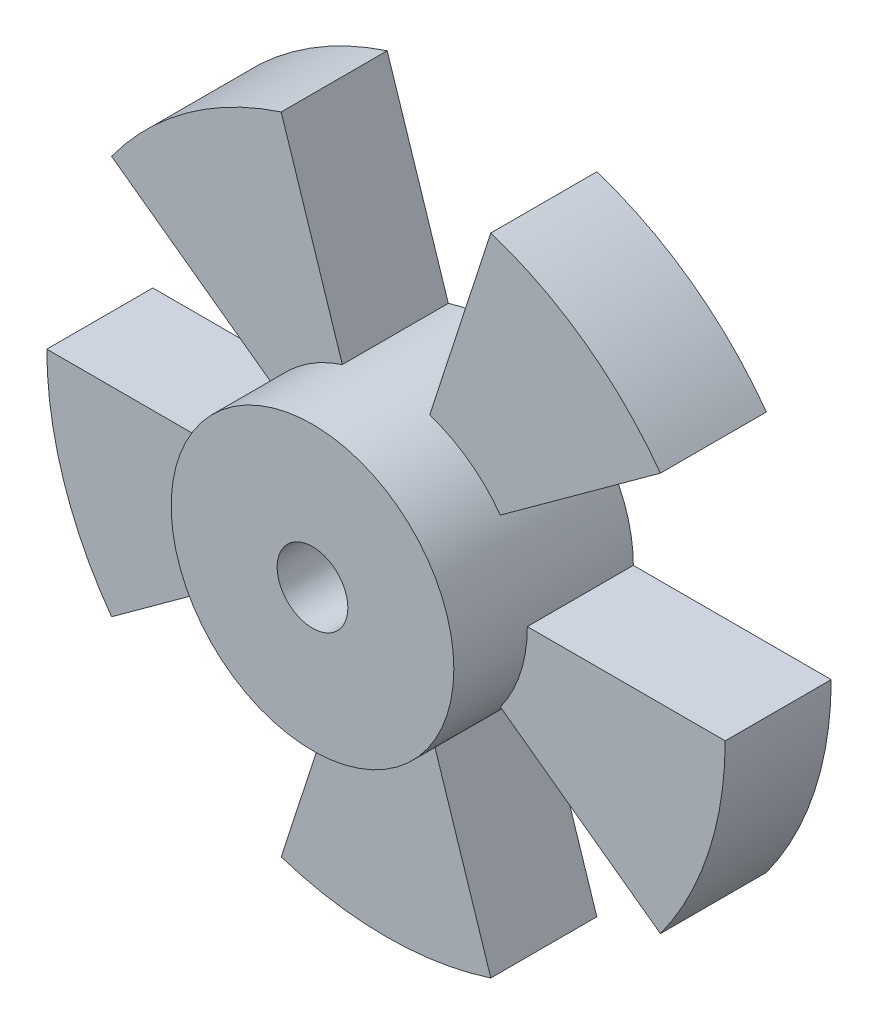
ISO-10303-21;
HEADER;
FILE_DESCRIPTION(('STEP AP214'),'2;1');
FILE_NAME('part.step','',(''),(''),'','','');
FILE_SCHEMA(('AUTOMOTIVE_DESIGN { 1 0 10303 214 1 1 1 1 }'));
ENDSEC;
DATA;
#1=APPLICATION_CONTEXT('core data for automotive mechanical design processes');
#2=APPLICATION_PROTOCOL_DEFINITION('international standard','automotive_design',2000,#1);
#3=PRODUCT_CONTEXT('',#1,'mechanical');
#4=PRODUCT('Part','Part','',(#3));
#5=PRODUCT_RELATED_PRODUCT_CATEGORY('part','',(#4));
#6=PRODUCT_DEFINITION_FORMATION('','',#4);
#7=PRODUCT_DEFINITION_CONTEXT('part definition',#1,'design');
#8=PRODUCT_DEFINITION('design','',#6,#7);
#9=PRODUCT_DEFINITION_SHAPE('','',#8);
#10=(LENGTH_UNIT() NAMED_UNIT(*) SI_UNIT(.MILLI.,.METRE.));
#11=(NAMED_UNIT(*) PLANE_ANGLE_UNIT() SI_UNIT($,.RADIAN.));
#12=(NAMED_UNIT(*) SI_UNIT($,.STERADIAN.) SOLID_ANGLE_UNIT());
#13=UNCERTAINTY_MEASURE_WITH_UNIT(LENGTH_MEASURE(1.E-05),#10,'distance_accuracy_value','');
#14=(GEOMETRIC_REPRESENTATION_CONTEXT(3) GLOBAL_UNCERTAINTY_ASSIGNED_CONTEXT((#13)) GLOBAL_UNIT_ASSIGNED_CONTEXT((#10,
#11,#12)) REPRESENTATION_CONTEXT('',''));
#15=CARTESIAN_POINT('',(0.,0.,0.));
#16=DIRECTION('',(0.,0.,1.));
#17=DIRECTION('',(1.,0.,0.));
#18=AXIS2_PLACEMENT_3D('',#15,#16,#17);
#19=CARTESIAN_POINT('',(0.,0.,3.));
#20=DIRECTION('',(0.,0.,-1.));
#21=DIRECTION('',(-1.,0.,0.));
#22=AXIS2_PLACEMENT_3D('',#19,#20,#21);
#23=CYLINDRICAL_SURFACE('',#22,2.);
#24=CARTESIAN_POINT('',(0.,0.,1.5));
#25=DIRECTION('',(0.,0.,1.));
#26=DIRECTION('',(1.,0.,0.));
#27=AXIS2_PLACEMENT_3D('',#24,#25,#26);
#28=CIRCLE('',#27,2.);
#29=CARTESIAN_POINT('',(-0.618033988749897,1.90211303259031,1.5));
#30=VERTEX_POINT('',#29);
#31=CARTESIAN_POINT('',(-1.6180339887499,1.17557050458494,1.5));
#32=VERTEX_POINT('',#31);
#33=EDGE_CURVE('E307',#30,#32,#28,.T.);
#34=ORIENTED_EDGE('',*,*,#33,.T.);
#35=DIRECTION('',(0.,0.,1.));
#36=VECTOR('',#35,1.);
#37=CARTESIAN_POINT('',(-1.6180339887499,1.17557050458494,-0.000999999999999916));
#38=LINE('',#37,#36);
#39=CARTESIAN_POINT('',(-1.6180339887499,1.17557050458494,0.));
#40=VERTEX_POINT('',#39);
#41=EDGE_CURVE('E267',#40,#32,#38,.T.);
#42=ORIENTED_EDGE('',*,*,#41,.F.);
#43=CARTESIAN_POINT('',(0.,0.,0.));
#44=DIRECTION('',(0.,0.,1.));
#45=DIRECTION('',(1.,0.,0.));
#46=AXIS2_PLACEMENT_3D('',#43,#44,#45);
#47=CIRCLE('',#46,2.);
#48=CARTESIAN_POINT('',(-2.,0.,0.));
#49=VERTEX_POINT('',#48);
#50=EDGE_CURVE('E256',#40,#49,#47,.T.);
#51=ORIENTED_EDGE('',*,*,#50,.T.);
#52=DIRECTION('',(0.,0.,1.));
#53=VECTOR('',#52,1.);
#54=CARTESIAN_POINT('',(-2.,0.,-0.000999999999999916));
#55=LINE('',#54,#53);
#56=CARTESIAN_POINT('',(-2.,0.,1.5));
#57=VERTEX_POINT('',#56);
#58=EDGE_CURVE('E268',#49,#57,#55,.T.);
#59=ORIENTED_EDGE('',*,*,#58,.T.);
#60=CARTESIAN_POINT('',(-1.61803398874989,-1.17557050458495,1.5));
#61=VERTEX_POINT('',#60);
#62=EDGE_CURVE('E309',#57,#61,#28,.T.);
#63=ORIENTED_EDGE('',*,*,#62,.T.);
#64=DIRECTION('',(0.,0.,1.));
#65=VECTOR('',#64,1.);
#66=CARTESIAN_POINT('',(-1.61803398874989,-1.17557050458495,-0.000999999999999916));
#67=LINE('',#66,#65);
#68=CARTESIAN_POINT('',(-1.61803398874989,-1.17557050458495,0.));
#69=VERTEX_POINT('',#68);
#70=EDGE_CURVE('E243',#69,#61,#67,.T.);
#71=ORIENTED_EDGE('',*,*,#70,.F.);
#72=CARTESIAN_POINT('',(0.,0.,0.));
#73=DIRECTION('',(0.,0.,1.));
#74=DIRECTION('',(1.,0.,0.));
#75=AXIS2_PLACEMENT_3D('',#72,#73,#74);
#76=CIRCLE('',#75,2.);
#77=CARTESIAN_POINT('',(-0.618033988749882,-1.90211303259031,0.));
#78=VERTEX_POINT('',#77);
#79=EDGE_CURVE('E232',#69,#78,#76,.T.);
#80=ORIENTED_EDGE('',*,*,#79,.T.);
#81=DIRECTION('',(0.,0.,1.));
#82=VECTOR('',#81,1.);
#83=CARTESIAN_POINT('',(-0.618033988749882,-1.90211303259031,-0.000999999999999916));
#84=LINE('',#83,#82);
#85=CARTESIAN_POINT('',(-0.618033988749882,-1.90211303259031,1.5));
#86=VERTEX_POINT('',#85);
#87=EDGE_CURVE('E244',#78,#86,#84,.T.);
#88=ORIENTED_EDGE('',*,*,#87,.T.);
#89=CARTESIAN_POINT('',(0.618033988749909,-1.9021130325903,1.5));
#90=VERTEX_POINT('',#89);
#91=EDGE_CURVE('E342',#86,#90,#28,.T.);
#92=ORIENTED_EDGE('',*,*,#91,.T.);
#93=DIRECTION('',(0.,0.,1.));
#94=VECTOR('',#93,1.);
#95=CARTESIAN_POINT('',(0.618033988749909,-1.9021130325903,-0.000999999999999916));
#96=LINE('',#95,#94);
#97=CARTESIAN_POINT('',(0.618033988749909,-1.9021130325903,0.));
#98=VERTEX_POINT('',#97);
#99=EDGE_CURVE('E220',#98,#90,#96,.T.);
#100=ORIENTED_EDGE('',*,*,#99,.F.);
#101=CARTESIAN_POINT('',(0.,0.,0.));
#102=DIRECTION('',(0.,0.,1.));
#103=DIRECTION('',(1.,0.,0.));
#104=AXIS2_PLACEMENT_3D('',#101,#102,#103);
#105=CIRCLE('',#104,2.);
#106=CARTESIAN_POINT('',(1.61803398874991,-1.17557050458493,0.));
#107=VERTEX_POINT('',#106);
#108=EDGE_CURVE('E192',#98,#107,#105,.T.);
#109=ORIENTED_EDGE('',*,*,#108,.T.);
#110=DIRECTION('',(0.,0.,1.));
#111=VECTOR('',#110,1.);
#112=CARTESIAN_POINT('',(1.61803398874991,-1.17557050458493,-0.000999999999999916));
#113=LINE('',#112,#111);
#114=CARTESIAN_POINT('',(1.61803398874991,-1.17557050458493,1.5));
#115=VERTEX_POINT('',#114);
#116=EDGE_CURVE('E221',#107,#115,#113,.T.);
#117=ORIENTED_EDGE('',*,*,#116,.T.);
#118=CARTESIAN_POINT('',(2.,0.,1.5));
#119=VERTEX_POINT('',#118);
#120=EDGE_CURVE('E180',#115,#119,#28,.T.);
#121=ORIENTED_EDGE('',*,*,#120,.T.);
#122=DIRECTION('',(0.,0.,1.));
#123=VECTOR('',#122,1.);
#124=CARTESIAN_POINT('',(2.,0.,-0.000999999999999916));
#125=LINE('',#124,#123);
#126=CARTESIAN_POINT('',(2.,0.,0.));
#127=VERTEX_POINT('',#126);
#128=EDGE_CURVE('E172',#127,#119,#125,.T.);
#129=ORIENTED_EDGE('',*,*,#128,.F.);
#130=CARTESIAN_POINT('',(0.,0.,0.));
#131=DIRECTION('',(0.,0.,1.));
#132=DIRECTION('',(1.,0.,0.));
#133=AXIS2_PLACEMENT_3D('',#130,#131,#132);
#134=CIRCLE('',#133,2.);
#135=CARTESIAN_POINT('',(1.61803398874988,1.17557050458497,0.));
#136=VERTEX_POINT('',#135);
#137=EDGE_CURVE('E177',#127,#136,#134,.T.);
#138=ORIENTED_EDGE('',*,*,#137,.T.);
#139=DIRECTION('',(0.,0.,1.));
#140=VECTOR('',#139,1.);
#141=CARTESIAN_POINT('',(1.61803398874988,1.17557050458497,-0.000999999999999916));
#142=LINE('',#141,#140);
#143=CARTESIAN_POINT('',(1.61803398874988,1.17557050458497,1.5));
#144=VERTEX_POINT('',#143);
#145=EDGE_CURVE('E193',#136,#144,#142,.T.);
#146=ORIENTED_EDGE('',*,*,#145,.T.);
#147=CARTESIAN_POINT('',(0.618033988749897,1.90211303259031,1.5));
#148=VERTEX_POINT('',#147);
#149=EDGE_CURVE('E306',#144,#148,#28,.T.);
#150=ORIENTED_EDGE('',*,*,#149,.T.);
#151=DIRECTION('',(0.,0.,1.));
#152=VECTOR('',#151,1.);
#153=CARTESIAN_POINT('',(0.618033988749897,1.90211303259031,-0.000999999999999916));
#154=LINE('',#153,#152);
#155=CARTESIAN_POINT('',(0.618033988749897,1.90211303259031,0.));
#156=VERTEX_POINT('',#155);
#157=EDGE_CURVE('E292',#156,#148,#154,.T.);
#158=ORIENTED_EDGE('',*,*,#157,.F.);
#159=CARTESIAN_POINT('',(0.,0.,0.));
#160=DIRECTION('',(0.,0.,1.));
#161=DIRECTION('',(1.,0.,0.));
#162=AXIS2_PLACEMENT_3D('',#159,#160,#161);
#163=CIRCLE('',#162,2.);
#164=CARTESIAN_POINT('',(-0.618033988749897,1.90211303259031,0.));
#165=VERTEX_POINT('',#164);
#166=EDGE_CURVE('E280',#156,#165,#163,.T.);
#167=ORIENTED_EDGE('',*,*,#166,.T.);
#168=DIRECTION('',(0.,0.,1.));
#169=VECTOR('',#168,1.);
#170=CARTESIAN_POINT('',(-0.618033988749897,1.90211303259031,-0.000999999999999916));
#171=LINE('',#170,#169);
#172=EDGE_CURVE('E293',#165,#30,#171,.T.);
#173=ORIENTED_EDGE('',*,*,#172,.T.);
#174=EDGE_LOOP('',(#34,#42,#51,#59,#63,#71,#80,#88,#92,#100,#109,#117,#121,#129,#138,#146,#150,
#158,#167,#173));
#175=FACE_BOUND('',#174,.T.);
#176=CARTESIAN_POINT('',(0.,0.,2.54));
#177=DIRECTION('',(0.,0.,1.));
#178=DIRECTION('',(1.,0.,0.));
#179=AXIS2_PLACEMENT_3D('',#176,#177,#178);
#180=CIRCLE('',#179,2.);
#181=CARTESIAN_POINT('',(2.,0.,2.54));
#182=VERTEX_POINT('',#181);
#183=EDGE_CURVE('E415',#182,#182,#180,.T.);
#184=ORIENTED_EDGE('',*,*,#183,.F.);
#185=EDGE_LOOP('',(#184));
#186=FACE_BOUND('',#185,.T.);
#187=ADVANCED_FACE('F32',(#175,#186),#23,.T.);
#188=CARTESIAN_POINT('',(0.,0.,3.));
#189=DIRECTION('',(0.,0.,1.));
#190=DIRECTION('',(1.,0.,0.));
#191=AXIS2_PLACEMENT_3D('',#188,#189,#190);
#192=CYLINDRICAL_SURFACE('',#191,0.500000000000013);
#193=CARTESIAN_POINT('',(0.,0.,0.));
#194=DIRECTION('',(0.,0.,1.));
#195=DIRECTION('',(1.,0.,0.));
#196=AXIS2_PLACEMENT_3D('',#193,#194,#195);
#197=CIRCLE('',#196,0.500000000000013);
#198=CARTESIAN_POINT('',(0.500000000000013,0.,0.));
#199=VERTEX_POINT('',#198);
#200=EDGE_CURVE('E198',#199,#199,#197,.T.);
#201=ORIENTED_EDGE('',*,*,#200,.F.);
#202=EDGE_LOOP('',(#201));
#203=FACE_BOUND('',#202,.T.);
#204=CARTESIAN_POINT('',(0.,0.,2.54));
#205=DIRECTION('',(0.,0.,1.));
#206=DIRECTION('',(1.,0.,0.));
#207=AXIS2_PLACEMENT_3D('',#204,#205,#206);
#208=CIRCLE('',#207,0.500000000000013);
#209=CARTESIAN_POINT('',(0.500000000000013,0.,2.54));
#210=VERTEX_POINT('',#209);
#211=EDGE_CURVE('E36',#210,#210,#208,.F.);
#212=ORIENTED_EDGE('',*,*,#211,.F.);
#213=EDGE_LOOP('',(#212));
#214=FACE_BOUND('',#213,.T.);
#215=ADVANCED_FACE('F392',(#203,#214),#192,.F.);
#216=CARTESIAN_POINT('',(0.,0.,1.5));
#217=DIRECTION('',(0.,0.,-1.));
#218=DIRECTION('',(-1.,0.,0.));
#219=AXIS2_PLACEMENT_3D('',#216,#217,#218);
#220=CYLINDRICAL_SURFACE('',#219,4.8);
#221=DIRECTION('',(0.,0.,1.));
#222=VECTOR('',#221,1.);
#223=CARTESIAN_POINT('',(3.88328157299971,2.82136921100392,-0.000999999999999916));
#224=LINE('',#223,#222);
#225=CARTESIAN_POINT('',(3.88328157299971,2.82136921100392,0.));
#226=VERTEX_POINT('',#225);
#227=CARTESIAN_POINT('',(3.88328157299971,2.82136921100392,1.5));
#228=VERTEX_POINT('',#227);
#229=EDGE_CURVE('E209',#226,#228,#224,.T.);
#230=ORIENTED_EDGE('',*,*,#229,.F.);
#231=CARTESIAN_POINT('',(0.,0.,0.));
#232=DIRECTION('',(0.,0.,1.));
#233=DIRECTION('',(1.,0.,0.));
#234=AXIS2_PLACEMENT_3D('',#231,#232,#233);
#235=CIRCLE('',#234,4.8);
#236=CARTESIAN_POINT('',(1.48328157299975,4.56507127821673,0.));
#237=VERTEX_POINT('',#236);
#238=EDGE_CURVE('E308',#226,#237,#235,.T.);
#239=ORIENTED_EDGE('',*,*,#238,.T.);
#240=DIRECTION('',(0.,0.,1.));
#241=VECTOR('',#240,1.);
#242=CARTESIAN_POINT('',(1.48328157299975,4.56507127821673,-0.000999999999999916));
#243=LINE('',#242,#241);
#244=CARTESIAN_POINT('',(1.48328157299975,4.56507127821673,1.5));
#245=VERTEX_POINT('',#244);
#246=EDGE_CURVE('E299',#237,#245,#243,.T.);
#247=ORIENTED_EDGE('',*,*,#246,.T.);
#248=CARTESIAN_POINT('',(0.,0.,1.5));
#249=DIRECTION('',(0.,0.,1.));
#250=DIRECTION('',(1.,0.,0.));
#251=AXIS2_PLACEMENT_3D('',#248,#249,#250);
#252=CIRCLE('',#251,4.8);
#253=EDGE_CURVE('E43',#228,#245,#252,.T.);
#254=ORIENTED_EDGE('',*,*,#253,.F.);
#255=EDGE_LOOP('',(#230,#239,#247,#254));
#256=FACE_BOUND('',#255,.T.);
#257=ADVANCED_FACE('F354',(#256),#220,.T.);
#258=CARTESIAN_POINT('',(0.,0.,1.5));
#259=DIRECTION('',(0.,0.,1.));
#260=DIRECTION('',(1.,0.,0.));
#261=AXIS2_PLACEMENT_3D('',#258,#259,#260);
#262=PLANE('',#261);
#263=ORIENTED_EDGE('',*,*,#149,.F.);
#264=DIRECTION('',(0.80901699437494,0.587785252292483,0.));
#265=VECTOR('',#264,1.);
#266=CARTESIAN_POINT('',(0.,0.,1.5));
#267=LINE('',#266,#265);
#268=EDGE_CURVE('E50',#144,#228,#267,.T.);
#269=ORIENTED_EDGE('',*,*,#268,.T.);
#270=ORIENTED_EDGE('',*,*,#253,.T.);
#271=DIRECTION('',(0.309016994374949,0.951056516295153,0.));
#272=VECTOR('',#271,1.);
#273=CARTESIAN_POINT('',(0.,0.,1.5));
#274=LINE('',#273,#272);
#275=EDGE_CURVE('E286',#148,#245,#274,.T.);
#276=ORIENTED_EDGE('',*,*,#275,.F.);
#277=EDGE_LOOP('',(#263,#269,#270,#276));
#278=FACE_BOUND('',#277,.T.);
#279=ADVANCED_FACE('F352',(#278),#262,.T.);
#280=CARTESIAN_POINT('',(0.,0.,0.));
#281=DIRECTION('',(0.,0.,1.));
#282=DIRECTION('',(1.,0.,0.));
#283=AXIS2_PLACEMENT_3D('',#280,#281,#282);
#284=PLANE('',#283);
#285=ORIENTED_EDGE('',*,*,#200,.T.);
#286=EDGE_LOOP('',(#285));
#287=FACE_BOUND('',#286,.T.);
#288=DIRECTION('',(-0.80901699437494,-0.587785252292483,0.));
#289=VECTOR('',#288,1.);
#290=CARTESIAN_POINT('',(0.,0.,0.));
#291=LINE('',#290,#289);
#292=EDGE_CURVE('E197',#226,#136,#291,.T.);
#293=ORIENTED_EDGE('',*,*,#292,.T.);
#294=ORIENTED_EDGE('',*,*,#137,.F.);
#295=DIRECTION('',(-1.,0.,0.));
#296=VECTOR('',#295,1.);
#297=CARTESIAN_POINT('',(0.,0.,0.));
#298=LINE('',#297,#296);
#299=CARTESIAN_POINT('',(4.8,0.,0.));
#300=VERTEX_POINT('',#299);
#301=EDGE_CURVE('E186',#300,#127,#298,.T.);
#302=ORIENTED_EDGE('',*,*,#301,.F.);
#303=CARTESIAN_POINT('',(3.88328157299978,-2.82136921100383,0.));
#304=VERTEX_POINT('',#303);
#305=EDGE_CURVE('E319',#304,#300,#235,.T.);
#306=ORIENTED_EDGE('',*,*,#305,.F.);
#307=DIRECTION('',(-0.809016994374953,0.587785252292465,0.));
#308=VECTOR('',#307,1.);
#309=CARTESIAN_POINT('',(0.,0.,0.));
#310=LINE('',#309,#308);
#311=EDGE_CURVE('E214',#304,#107,#310,.T.);
#312=ORIENTED_EDGE('',*,*,#311,.T.);
#313=ORIENTED_EDGE('',*,*,#108,.F.);
#314=DIRECTION('',(-0.309016994374955,0.951056516295151,0.));
#315=VECTOR('',#314,1.);
#316=CARTESIAN_POINT('',(0.,0.,0.));
#317=LINE('',#316,#315);
#318=CARTESIAN_POINT('',(1.48328157299978,-4.56507127821672,0.));
#319=VERTEX_POINT('',#318);
#320=EDGE_CURVE('E223',#319,#98,#317,.T.);
#321=ORIENTED_EDGE('',*,*,#320,.F.);
#322=CARTESIAN_POINT('',(-1.48328157299972,-4.56507127821675,0.));
#323=VERTEX_POINT('',#322);
#324=EDGE_CURVE('E318',#323,#319,#235,.T.);
#325=ORIENTED_EDGE('',*,*,#324,.F.);
#326=DIRECTION('',(0.309016994374941,0.951056516295156,0.));
#327=VECTOR('',#326,1.);
#328=CARTESIAN_POINT('',(0.,0.,0.));
#329=LINE('',#328,#327);
#330=EDGE_CURVE('E235',#323,#78,#329,.T.);
#331=ORIENTED_EDGE('',*,*,#330,.T.);
#332=ORIENTED_EDGE('',*,*,#79,.F.);
#333=DIRECTION('',(0.809016994374945,0.587785252292477,0.));
#334=VECTOR('',#333,1.);
#335=CARTESIAN_POINT('',(0.,0.,0.));
#336=LINE('',#335,#334);
#337=CARTESIAN_POINT('',(-3.88328157299973,-2.82136921100389,0.));
#338=VERTEX_POINT('',#337);
#339=EDGE_CURVE('E247',#338,#69,#336,.T.);
#340=ORIENTED_EDGE('',*,*,#339,.F.);
#341=CARTESIAN_POINT('',(-4.8,0.,0.));
#342=VERTEX_POINT('',#341);
#343=EDGE_CURVE('E312',#342,#338,#235,.T.);
#344=ORIENTED_EDGE('',*,*,#343,.F.);
#345=DIRECTION('',(1.,0.,0.));
#346=VECTOR('',#345,1.);
#347=CARTESIAN_POINT('',(0.,0.,0.));
#348=LINE('',#347,#346);
#349=EDGE_CURVE('E259',#342,#49,#348,.T.);
#350=ORIENTED_EDGE('',*,*,#349,.T.);
#351=ORIENTED_EDGE('',*,*,#50,.F.);
#352=DIRECTION('',(0.809016994374948,-0.587785252292472,0.));
#353=VECTOR('',#352,1.);
#354=CARTESIAN_POINT('',(0.,0.,0.));
#355=LINE('',#354,#353);
#356=CARTESIAN_POINT('',(-3.88328157299975,2.82136921100387,0.));
#357=VERTEX_POINT('',#356);
#358=EDGE_CURVE('E271',#357,#40,#355,.T.);
#359=ORIENTED_EDGE('',*,*,#358,.F.);
#360=CARTESIAN_POINT('',(-1.48328157299975,4.56507127821673,0.));
#361=VERTEX_POINT('',#360);
#362=EDGE_CURVE('E310',#361,#357,#235,.T.);
#363=ORIENTED_EDGE('',*,*,#362,.F.);
#364=DIRECTION('',(0.309016994374949,-0.951056516295153,0.));
#365=VECTOR('',#364,1.);
#366=CARTESIAN_POINT('',(0.,0.,0.));
#367=LINE('',#366,#365);
#368=EDGE_CURVE('E283',#361,#165,#367,.T.);
#369=ORIENTED_EDGE('',*,*,#368,.T.);
#370=ORIENTED_EDGE('',*,*,#166,.F.);
#371=DIRECTION('',(-0.309016994374949,-0.951056516295153,0.));
#372=VECTOR('',#371,1.);
#373=CARTESIAN_POINT('',(0.,0.,0.));
#374=LINE('',#373,#372);
#375=EDGE_CURVE('E296',#237,#156,#374,.T.);
#376=ORIENTED_EDGE('',*,*,#375,.F.);
#377=ORIENTED_EDGE('',*,*,#238,.F.);
#378=EDGE_LOOP('',(#293,#294,#302,#306,#312,#313,#321,#325,#331,#332,#340,#344,#350,#351,#359,
#363,#369,#370,#376,#377));
#379=FACE_BOUND('',#378,.T.);
#380=ADVANCED_FACE('F195',(#287,#379),#284,.F.);
#381=ORIENTED_EDGE('',*,*,#305,.T.);
#382=DIRECTION('',(0.,0.,1.));
#383=VECTOR('',#382,1.);
#384=CARTESIAN_POINT('',(4.8,0.,-0.000999999999999916));
#385=LINE('',#384,#383);
#386=CARTESIAN_POINT('',(4.8,0.,1.5));
#387=VERTEX_POINT('',#386);
#388=EDGE_CURVE('E183',#300,#387,#385,.T.);
#389=ORIENTED_EDGE('',*,*,#388,.T.);
#390=CARTESIAN_POINT('',(3.88328157299978,-2.82136921100383,1.5));
#391=VERTEX_POINT('',#390);
#392=EDGE_CURVE('E316',#391,#387,#252,.T.);
#393=ORIENTED_EDGE('',*,*,#392,.F.);
#394=DIRECTION('',(0.,0.,1.));
#395=VECTOR('',#394,1.);
#396=CARTESIAN_POINT('',(3.88328157299978,-2.82136921100383,-0.000999999999999916));
#397=LINE('',#396,#395);
#398=EDGE_CURVE('E224',#304,#391,#397,.T.);
#399=ORIENTED_EDGE('',*,*,#398,.F.);
#400=EDGE_LOOP('',(#381,#389,#393,#399));
#401=FACE_BOUND('',#400,.T.);
#402=ADVANCED_FACE('F403',(#401),#220,.T.);
#403=DIRECTION('',(1.,0.,0.));
#404=VECTOR('',#403,1.);
#405=CARTESIAN_POINT('',(0.,0.,1.5));
#406=LINE('',#405,#404);
#407=EDGE_CURVE('E200',#119,#387,#406,.T.);
#408=ORIENTED_EDGE('',*,*,#407,.F.);
#409=ORIENTED_EDGE('',*,*,#120,.F.);
#410=DIRECTION('',(0.809016994374953,-0.587785252292465,0.));
#411=VECTOR('',#410,1.);
#412=CARTESIAN_POINT('',(0.,0.,1.5));
#413=LINE('',#412,#411);
#414=EDGE_CURVE('E58',#115,#391,#413,.T.);
#415=ORIENTED_EDGE('',*,*,#414,.T.);
#416=ORIENTED_EDGE('',*,*,#392,.T.);
#417=EDGE_LOOP('',(#408,#409,#415,#416));
#418=FACE_BOUND('',#417,.T.);
#419=ADVANCED_FACE('F409',(#418),#262,.T.);
#420=ORIENTED_EDGE('',*,*,#324,.T.);
#421=DIRECTION('',(0.,0.,1.));
#422=VECTOR('',#421,1.);
#423=CARTESIAN_POINT('',(1.48328157299978,-4.56507127821672,-0.000999999999999916));
#424=LINE('',#423,#422);
#425=CARTESIAN_POINT('',(1.48328157299978,-4.56507127821672,1.5));
#426=VERTEX_POINT('',#425);
#427=EDGE_CURVE('E226',#319,#426,#424,.T.);
#428=ORIENTED_EDGE('',*,*,#427,.T.);
#429=CARTESIAN_POINT('',(-1.48328157299972,-4.56507127821675,1.5));
#430=VERTEX_POINT('',#429);
#431=EDGE_CURVE('E343',#430,#426,#252,.T.);
#432=ORIENTED_EDGE('',*,*,#431,.F.);
#433=DIRECTION('',(0.,0.,1.));
#434=VECTOR('',#433,1.);
#435=CARTESIAN_POINT('',(-1.48328157299972,-4.56507127821675,-0.000999999999999916));
#436=LINE('',#435,#434);
#437=EDGE_CURVE('E248',#323,#430,#436,.T.);
#438=ORIENTED_EDGE('',*,*,#437,.F.);
#439=EDGE_LOOP('',(#420,#428,#432,#438));
#440=FACE_BOUND('',#439,.T.);
#441=ADVANCED_FACE('F329',(#440),#220,.T.);
#442=DIRECTION('',(0.309016994374955,-0.951056516295151,0.));
#443=VECTOR('',#442,1.);
#444=CARTESIAN_POINT('',(0.,0.,1.5));
#445=LINE('',#444,#443);
#446=EDGE_CURVE('E217',#90,#426,#445,.T.);
#447=ORIENTED_EDGE('',*,*,#446,.F.);
#448=ORIENTED_EDGE('',*,*,#91,.F.);
#449=DIRECTION('',(-0.309016994374941,-0.951056516295156,0.));
#450=VECTOR('',#449,1.);
#451=CARTESIAN_POINT('',(0.,0.,1.5));
#452=LINE('',#451,#450);
#453=EDGE_CURVE('E240',#86,#430,#452,.T.);
#454=ORIENTED_EDGE('',*,*,#453,.T.);
#455=ORIENTED_EDGE('',*,*,#431,.T.);
#456=EDGE_LOOP('',(#447,#448,#454,#455));
#457=FACE_BOUND('',#456,.T.);
#458=ADVANCED_FACE('F341',(#457),#262,.T.);
#459=ORIENTED_EDGE('',*,*,#343,.T.);
#460=DIRECTION('',(0.,0.,1.));
#461=VECTOR('',#460,1.);
#462=CARTESIAN_POINT('',(-3.88328157299973,-2.82136921100389,-0.000999999999999916));
#463=LINE('',#462,#461);
#464=CARTESIAN_POINT('',(-3.88328157299973,-2.82136921100389,1.5));
#465=VERTEX_POINT('',#464);
#466=EDGE_CURVE('E250',#338,#465,#463,.T.);
#467=ORIENTED_EDGE('',*,*,#466,.T.);
#468=CARTESIAN_POINT('',(-4.8,0.,1.5));
#469=VERTEX_POINT('',#468);
#470=EDGE_CURVE('E41',#469,#465,#252,.T.);
#471=ORIENTED_EDGE('',*,*,#470,.F.);
#472=DIRECTION('',(0.,0.,1.));
#473=VECTOR('',#472,1.);
#474=CARTESIAN_POINT('',(-4.8,0.,-0.000999999999999916));
#475=LINE('',#474,#473);
#476=EDGE_CURVE('E272',#342,#469,#475,.T.);
#477=ORIENTED_EDGE('',*,*,#476,.F.);
#478=EDGE_LOOP('',(#459,#467,#471,#477));
#479=FACE_BOUND('',#478,.T.);
#480=ADVANCED_FACE('F377',(#479),#220,.T.);
#481=DIRECTION('',(-0.809016994374945,-0.587785252292477,0.));
#482=VECTOR('',#481,1.);
#483=CARTESIAN_POINT('',(0.,0.,1.5));
#484=LINE('',#483,#482);
#485=EDGE_CURVE('E238',#61,#465,#484,.T.);
#486=ORIENTED_EDGE('',*,*,#485,.F.);
#487=ORIENTED_EDGE('',*,*,#62,.F.);
#488=DIRECTION('',(-1.,0.,0.));
#489=VECTOR('',#488,1.);
#490=CARTESIAN_POINT('',(0.,0.,1.5));
#491=LINE('',#490,#489);
#492=EDGE_CURVE('E264',#57,#469,#491,.T.);
#493=ORIENTED_EDGE('',*,*,#492,.T.);
#494=ORIENTED_EDGE('',*,*,#470,.T.);
#495=EDGE_LOOP('',(#486,#487,#493,#494));
#496=FACE_BOUND('',#495,.T.);
#497=ADVANCED_FACE('F370',(#496),#262,.T.);
#498=ORIENTED_EDGE('',*,*,#362,.T.);
#499=DIRECTION('',(0.,0.,1.));
#500=VECTOR('',#499,1.);
#501=CARTESIAN_POINT('',(-3.88328157299975,2.82136921100387,-0.000999999999999916));
#502=LINE('',#501,#500);
#503=CARTESIAN_POINT('',(-3.88328157299975,2.82136921100387,1.5));
#504=VERTEX_POINT('',#503);
#505=EDGE_CURVE('E274',#357,#504,#502,.T.);
#506=ORIENTED_EDGE('',*,*,#505,.T.);
#507=CARTESIAN_POINT('',(-1.48328157299975,4.56507127821673,1.5));
#508=VERTEX_POINT('',#507);
#509=EDGE_CURVE('E11',#508,#504,#252,.T.);
#510=ORIENTED_EDGE('',*,*,#509,.F.);
#511=DIRECTION('',(0.,0.,1.));
#512=VECTOR('',#511,1.);
#513=CARTESIAN_POINT('',(-1.48328157299975,4.56507127821673,-0.000999999999999916));
#514=LINE('',#513,#512);
#515=EDGE_CURVE('E297',#361,#508,#514,.T.);
#516=ORIENTED_EDGE('',*,*,#515,.F.);
#517=EDGE_LOOP('',(#498,#506,#510,#516));
#518=FACE_BOUND('',#517,.T.);
#519=ADVANCED_FACE('F34',(#518),#220,.T.);
#520=DIRECTION('',(-0.809016994374949,0.587785252292472,0.));
#521=VECTOR('',#520,1.);
#522=CARTESIAN_POINT('',(0.,0.,1.5));
#523=LINE('',#522,#521);
#524=EDGE_CURVE('E262',#32,#504,#523,.T.);
#525=ORIENTED_EDGE('',*,*,#524,.F.);
#526=ORIENTED_EDGE('',*,*,#33,.F.);
#527=DIRECTION('',(-0.309016994374949,0.951056516295153,0.));
#528=VECTOR('',#527,1.);
#529=CARTESIAN_POINT('',(0.,0.,1.5));
#530=LINE('',#529,#528);
#531=EDGE_CURVE('E289',#30,#508,#530,.T.);
#532=ORIENTED_EDGE('',*,*,#531,.T.);
#533=ORIENTED_EDGE('',*,*,#509,.T.);
#534=EDGE_LOOP('',(#525,#526,#532,#533));
#535=FACE_BOUND('',#534,.T.);
#536=ADVANCED_FACE('F359',(#535),#262,.T.);
#537=CARTESIAN_POINT('',(0.,0.,-0.000999999999999916));
#538=DIRECTION('',(0.951056516295153,0.309016994374949,0.));
#539=DIRECTION('',(-0.309016994374949,0.951056516295153,0.));
#540=AXIS2_PLACEMENT_3D('',#537,#538,#539);
#541=PLANE('',#540);
#542=ORIENTED_EDGE('',*,*,#515,.T.);
#543=ORIENTED_EDGE('',*,*,#531,.F.);
#544=ORIENTED_EDGE('',*,*,#172,.F.);
#545=ORIENTED_EDGE('',*,*,#368,.F.);
#546=EDGE_LOOP('',(#542,#543,#544,#545));
#547=FACE_BOUND('',#546,.T.);
#548=ADVANCED_FACE('F388',(#547),#541,.T.);
#549=CARTESIAN_POINT('',(0.,0.,-0.000999999999999916));
#550=DIRECTION('',(0.951056516295153,-0.309016994374949,0.));
#551=DIRECTION('',(0.309016994374949,0.951056516295153,0.));
#552=AXIS2_PLACEMENT_3D('',#549,#550,#551);
#553=PLANE('',#552);
#554=ORIENTED_EDGE('',*,*,#375,.T.);
#555=ORIENTED_EDGE('',*,*,#157,.T.);
#556=ORIENTED_EDGE('',*,*,#275,.T.);
#557=ORIENTED_EDGE('',*,*,#246,.F.);
#558=EDGE_LOOP('',(#554,#555,#556,#557));
#559=FACE_BOUND('',#558,.T.);
#560=ADVANCED_FACE('F349',(#559),#553,.F.);
#561=CARTESIAN_POINT('',(0.,0.,-0.000999999999999916));
#562=DIRECTION('',(0.,1.,0.));
#563=DIRECTION('',(-1.,0.,0.));
#564=AXIS2_PLACEMENT_3D('',#561,#562,#563);
#565=PLANE('',#564);
#566=ORIENTED_EDGE('',*,*,#476,.T.);
#567=ORIENTED_EDGE('',*,*,#492,.F.);
#568=ORIENTED_EDGE('',*,*,#58,.F.);
#569=ORIENTED_EDGE('',*,*,#349,.F.);
#570=EDGE_LOOP('',(#566,#567,#568,#569));
#571=FACE_BOUND('',#570,.T.);
#572=ADVANCED_FACE('F379',(#571),#565,.T.);
#573=CARTESIAN_POINT('',(0.,0.,-0.000999999999999916));
#574=DIRECTION('',(0.587785252292472,0.809016994374948,0.));
#575=DIRECTION('',(-0.809016994374948,0.587785252292472,0.));
#576=AXIS2_PLACEMENT_3D('',#573,#574,#575);
#577=PLANE('',#576);
#578=ORIENTED_EDGE('',*,*,#358,.T.);
#579=ORIENTED_EDGE('',*,*,#41,.T.);
#580=ORIENTED_EDGE('',*,*,#524,.T.);
#581=ORIENTED_EDGE('',*,*,#505,.F.);
#582=EDGE_LOOP('',(#578,#579,#580,#581));
#583=FACE_BOUND('',#582,.T.);
#584=ADVANCED_FACE('F362',(#583),#577,.F.);
#585=CARTESIAN_POINT('',(0.,0.,-0.000999999999999916));
#586=DIRECTION('',(-0.951056516295156,0.309016994374941,0.));
#587=DIRECTION('',(-0.309016994374941,-0.951056516295156,0.));
#588=AXIS2_PLACEMENT_3D('',#585,#586,#587);
#589=PLANE('',#588);
#590=ORIENTED_EDGE('',*,*,#437,.T.);
#591=ORIENTED_EDGE('',*,*,#453,.F.);
#592=ORIENTED_EDGE('',*,*,#87,.F.);
#593=ORIENTED_EDGE('',*,*,#330,.F.);
#594=EDGE_LOOP('',(#590,#591,#592,#593));
#595=FACE_BOUND('',#594,.T.);
#596=ADVANCED_FACE('F386',(#595),#589,.T.);
#597=CARTESIAN_POINT('',(0.,0.,-0.000999999999999916));
#598=DIRECTION('',(-0.587785252292477,0.809016994374945,0.));
#599=DIRECTION('',(-0.809016994374945,-0.587785252292477,0.));
#600=AXIS2_PLACEMENT_3D('',#597,#598,#599);
#601=PLANE('',#600);
#602=ORIENTED_EDGE('',*,*,#339,.T.);
#603=ORIENTED_EDGE('',*,*,#70,.T.);
#604=ORIENTED_EDGE('',*,*,#485,.T.);
#605=ORIENTED_EDGE('',*,*,#466,.F.);
#606=EDGE_LOOP('',(#602,#603,#604,#605));
#607=FACE_BOUND('',#606,.T.);
#608=ADVANCED_FACE('F374',(#607),#601,.F.);
#609=CARTESIAN_POINT('',(0.,0.,-0.000999999999999916));
#610=DIRECTION('',(-0.587785252292465,-0.809016994374953,0.));
#611=DIRECTION('',(0.809016994374953,-0.587785252292465,0.));
#612=AXIS2_PLACEMENT_3D('',#609,#610,#611);
#613=PLANE('',#612);
#614=ORIENTED_EDGE('',*,*,#398,.T.);
#615=ORIENTED_EDGE('',*,*,#414,.F.);
#616=ORIENTED_EDGE('',*,*,#116,.F.);
#617=ORIENTED_EDGE('',*,*,#311,.F.);
#618=EDGE_LOOP('',(#614,#615,#616,#617));
#619=FACE_BOUND('',#618,.T.);
#620=ADVANCED_FACE('F430',(#619),#613,.T.);
#621=CARTESIAN_POINT('',(0.,0.,-0.000999999999999916));
#622=DIRECTION('',(-0.951056516295151,-0.309016994374955,0.));
#623=DIRECTION('',(0.309016994374955,-0.951056516295151,0.));
#624=AXIS2_PLACEMENT_3D('',#621,#622,#623);
#625=PLANE('',#624);
#626=ORIENTED_EDGE('',*,*,#320,.T.);
#627=ORIENTED_EDGE('',*,*,#99,.T.);
#628=ORIENTED_EDGE('',*,*,#446,.T.);
#629=ORIENTED_EDGE('',*,*,#427,.F.);
#630=EDGE_LOOP('',(#626,#627,#628,#629));
#631=FACE_BOUND('',#630,.T.);
#632=ADVANCED_FACE('F336',(#631),#625,.F.);
#633=CARTESIAN_POINT('',(0.,0.,-0.000999999999999916));
#634=DIRECTION('',(0.587785252292483,-0.80901699437494,0.));
#635=DIRECTION('',(0.80901699437494,0.587785252292483,0.));
#636=AXIS2_PLACEMENT_3D('',#633,#634,#635);
#637=PLANE('',#636);
#638=ORIENTED_EDGE('',*,*,#229,.T.);
#639=ORIENTED_EDGE('',*,*,#268,.F.);
#640=ORIENTED_EDGE('',*,*,#145,.F.);
#641=ORIENTED_EDGE('',*,*,#292,.F.);
#642=EDGE_LOOP('',(#638,#639,#640,#641));
#643=FACE_BOUND('',#642,.T.);
#644=ADVANCED_FACE('F425',(#643),#637,.T.);
#645=CARTESIAN_POINT('',(0.,0.,-0.000999999999999916));
#646=DIRECTION('',(0.,-1.,0.));
#647=DIRECTION('',(1.,0.,0.));
#648=AXIS2_PLACEMENT_3D('',#645,#646,#647);
#649=PLANE('',#648);
#650=ORIENTED_EDGE('',*,*,#301,.T.);
#651=ORIENTED_EDGE('',*,*,#128,.T.);
#652=ORIENTED_EDGE('',*,*,#407,.T.);
#653=ORIENTED_EDGE('',*,*,#388,.F.);
#654=EDGE_LOOP('',(#650,#651,#652,#653));
#655=FACE_BOUND('',#654,.T.);
#656=ADVANCED_FACE('F187',(#655),#649,.F.);
#657=CARTESIAN_POINT('',(0.,0.,2.54));
#658=DIRECTION('',(0.,0.,1.));
#659=DIRECTION('',(1.,0.,0.));
#660=AXIS2_PLACEMENT_3D('',#657,#658,#659);
#661=PLANE('',#660);
#662=ORIENTED_EDGE('',*,*,#183,.T.);
#663=EDGE_LOOP('',(#662));
#664=FACE_BOUND('',#663,.T.);
#665=ORIENTED_EDGE('',*,*,#211,.T.);
#666=EDGE_LOOP('',(#665));
#667=FACE_BOUND('',#666,.T.);
#668=ADVANCED_FACE('F419',(#664,#667),#661,.T.);
#669=CLOSED_SHELL('',(#187,#215,#257,#279,#380,#402,#419,#441,#458,#480,#497,#519,#536,#548,
#560,#572,#584,#596,#608,#620,#632,#644,#656,#668));
#670=MANIFOLD_SOLID_BREP('B2',#669);
#671=ADVANCED_BREP_SHAPE_REPRESENTATION('',(#18,#670),#14);
#672=SHAPE_DEFINITION_REPRESENTATION(#9,#671);
ENDSEC;
END-ISO-10303-21;
